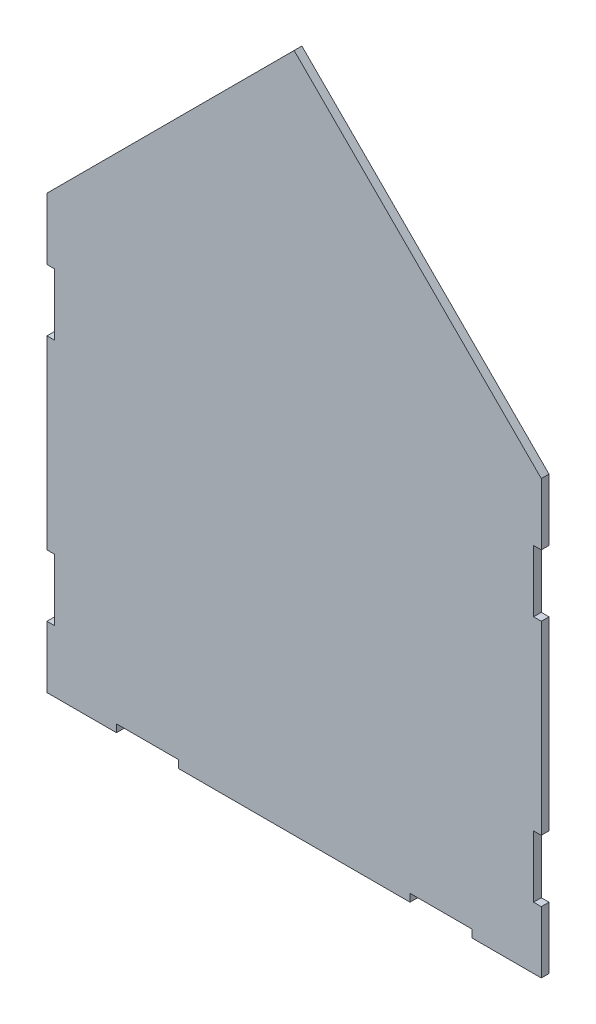
ISO-10303-21;
HEADER;
FILE_DESCRIPTION(('STEP AP214'),'2;1');
FILE_NAME('part.step','',(''),(''),'','','');
FILE_SCHEMA(('AUTOMOTIVE_DESIGN { 1 0 10303 214 1 1 1 1 }'));
ENDSEC;
DATA;
#1=APPLICATION_CONTEXT('core data for automotive mechanical design processes');
#2=APPLICATION_PROTOCOL_DEFINITION('international standard','automotive_design',2000,#1);
#3=PRODUCT_CONTEXT('',#1,'mechanical');
#4=PRODUCT('Part','Part','',(#3));
#5=PRODUCT_RELATED_PRODUCT_CATEGORY('part','',(#4));
#6=PRODUCT_DEFINITION_FORMATION('','',#4);
#7=PRODUCT_DEFINITION_CONTEXT('part definition',#1,'design');
#8=PRODUCT_DEFINITION('design','',#6,#7);
#9=PRODUCT_DEFINITION_SHAPE('','',#8);
#10=(LENGTH_UNIT() NAMED_UNIT(*) SI_UNIT(.MILLI.,.METRE.));
#11=(NAMED_UNIT(*) PLANE_ANGLE_UNIT() SI_UNIT($,.RADIAN.));
#12=(NAMED_UNIT(*) SI_UNIT($,.STERADIAN.) SOLID_ANGLE_UNIT());
#13=UNCERTAINTY_MEASURE_WITH_UNIT(LENGTH_MEASURE(1.E-05),#10,'distance_accuracy_value','');
#14=(GEOMETRIC_REPRESENTATION_CONTEXT(3) GLOBAL_UNCERTAINTY_ASSIGNED_CONTEXT((#13)) GLOBAL_UNIT_ASSIGNED_CONTEXT((#10,
#11,#12)) REPRESENTATION_CONTEXT('',''));
#15=CARTESIAN_POINT('',(0.,0.,0.));
#16=DIRECTION('',(0.,0.,1.));
#17=DIRECTION('',(1.,0.,0.));
#18=AXIS2_PLACEMENT_3D('',#15,#16,#17);
#19=CARTESIAN_POINT('',(102.496774406491,177.8,3.175));
#20=DIRECTION('',(-0.707106781186548,-0.707106781186548,0.));
#21=DIRECTION('',(0.707106781186548,-0.707106781186547,0.));
#22=AXIS2_PLACEMENT_3D('',#19,#20,#21);
#23=PLANE('',#22);
#24=DIRECTION('',(-0.707106781186547,0.707106781186547,0.));
#25=VECTOR('',#24,1.);
#26=CARTESIAN_POINT('',(102.496774406491,177.8,0.));
#27=LINE('',#26,#25);
#28=CARTESIAN_POINT('',(102.496774406491,177.8,0.));
#29=VERTEX_POINT('',#28);
#30=CARTESIAN_POINT('',(0.896774406491149,279.4,0.));
#31=VERTEX_POINT('',#30);
#32=EDGE_CURVE('E257',#29,#31,#27,.T.);
#33=ORIENTED_EDGE('',*,*,#32,.T.);
#34=DIRECTION('',(0.,0.,-1.));
#35=VECTOR('',#34,1.);
#36=CARTESIAN_POINT('',(0.896774406491149,279.4,3.175));
#37=LINE('',#36,#35);
#38=CARTESIAN_POINT('',(0.896774406491149,279.4,3.175));
#39=VERTEX_POINT('',#38);
#40=EDGE_CURVE('E11',#39,#31,#37,.T.);
#41=ORIENTED_EDGE('',*,*,#40,.F.);
#42=DIRECTION('',(-0.707106781186547,0.707106781186547,0.));
#43=VECTOR('',#42,1.);
#44=CARTESIAN_POINT('',(102.496774406491,177.8,3.175));
#45=LINE('',#44,#43);
#46=CARTESIAN_POINT('',(102.496774406491,177.8,3.175));
#47=VERTEX_POINT('',#46);
#48=EDGE_CURVE('E313',#47,#39,#45,.T.);
#49=ORIENTED_EDGE('',*,*,#48,.F.);
#50=DIRECTION('',(0.,0.,-1.));
#51=VECTOR('',#50,1.);
#52=CARTESIAN_POINT('',(102.496774406491,177.8,3.175));
#53=LINE('',#52,#51);
#54=EDGE_CURVE('E253',#47,#29,#53,.T.);
#55=ORIENTED_EDGE('',*,*,#54,.T.);
#56=EDGE_LOOP('',(#33,#41,#49,#55));
#57=FACE_BOUND('',#56,.T.);
#58=ADVANCED_FACE('F35',(#57),#23,.F.);
#59=CARTESIAN_POINT('',(0.896774406491149,279.4,3.175));
#60=DIRECTION('',(0.707106781186547,-0.707106781186548,0.));
#61=DIRECTION('',(0.707106781186548,0.707106781186547,0.));
#62=AXIS2_PLACEMENT_3D('',#59,#60,#61);
#63=PLANE('',#62);
#64=DIRECTION('',(-0.707106781186548,-0.707106781186547,0.));
#65=VECTOR('',#64,1.);
#66=CARTESIAN_POINT('',(0.896774406491149,279.4,0.));
#67=LINE('',#66,#65);
#68=CARTESIAN_POINT('',(-100.703225593509,177.8,0.));
#69=VERTEX_POINT('',#68);
#70=EDGE_CURVE('E260',#31,#69,#67,.T.);
#71=ORIENTED_EDGE('',*,*,#70,.T.);
#72=DIRECTION('',(0.,0.,-1.));
#73=VECTOR('',#72,1.);
#74=CARTESIAN_POINT('',(-100.703225593509,177.8,3.175));
#75=LINE('',#74,#73);
#76=CARTESIAN_POINT('',(-100.703225593509,177.8,3.175));
#77=VERTEX_POINT('',#76);
#78=EDGE_CURVE('E43',#77,#69,#75,.T.);
#79=ORIENTED_EDGE('',*,*,#78,.F.);
#80=DIRECTION('',(-0.707106781186548,-0.707106781186547,0.));
#81=VECTOR('',#80,1.);
#82=CARTESIAN_POINT('',(0.896774406491149,279.4,3.175));
#83=LINE('',#82,#81);
#84=EDGE_CURVE('E157',#39,#77,#83,.T.);
#85=ORIENTED_EDGE('',*,*,#84,.F.);
#86=ORIENTED_EDGE('',*,*,#40,.T.);
#87=EDGE_LOOP('',(#71,#79,#85,#86));
#88=FACE_BOUND('',#87,.T.);
#89=ADVANCED_FACE('F476',(#88),#63,.F.);
#90=CARTESIAN_POINT('',(-100.703225593509,177.8,3.175));
#91=DIRECTION('',(1.,0.,0.));
#92=DIRECTION('',(0.,1.,0.));
#93=AXIS2_PLACEMENT_3D('',#90,#91,#92);
#94=PLANE('',#93);
#95=DIRECTION('',(0.,-1.,0.));
#96=VECTOR('',#95,1.);
#97=CARTESIAN_POINT('',(-100.703225593509,177.8,0.));
#98=LINE('',#97,#96);
#99=CARTESIAN_POINT('',(-100.703225593509,152.4,0.));
#100=VERTEX_POINT('',#99);
#101=EDGE_CURVE('E262',#69,#100,#98,.T.);
#102=ORIENTED_EDGE('',*,*,#101,.T.);
#103=DIRECTION('',(0.,0.,-1.));
#104=VECTOR('',#103,1.);
#105=CARTESIAN_POINT('',(-100.703225593509,152.4,3.175));
#106=LINE('',#105,#104);
#107=CARTESIAN_POINT('',(-100.703225593509,152.4,3.175));
#108=VERTEX_POINT('',#107);
#109=EDGE_CURVE('E383',#108,#100,#106,.T.);
#110=ORIENTED_EDGE('',*,*,#109,.F.);
#111=DIRECTION('',(0.,-1.,0.));
#112=VECTOR('',#111,1.);
#113=CARTESIAN_POINT('',(-100.703225593509,177.8,3.175));
#114=LINE('',#113,#112);
#115=EDGE_CURVE('E391',#77,#108,#114,.T.);
#116=ORIENTED_EDGE('',*,*,#115,.F.);
#117=ORIENTED_EDGE('',*,*,#78,.T.);
#118=EDGE_LOOP('',(#102,#110,#116,#117));
#119=FACE_BOUND('',#118,.T.);
#120=ADVANCED_FACE('F389',(#119),#94,.F.);
#121=CARTESIAN_POINT('',(-100.703225593509,152.4,3.175));
#122=DIRECTION('',(0.,1.,0.));
#123=DIRECTION('',(0.,0.,1.));
#124=AXIS2_PLACEMENT_3D('',#121,#122,#123);
#125=PLANE('',#124);
#126=DIRECTION('',(1.,0.,0.));
#127=VECTOR('',#126,1.);
#128=CARTESIAN_POINT('',(-100.703225593509,152.4,0.));
#129=LINE('',#128,#127);
#130=CARTESIAN_POINT('',(-97.5282255935089,152.4,0.));
#131=VERTEX_POINT('',#130);
#132=EDGE_CURVE('E264',#100,#131,#129,.T.);
#133=ORIENTED_EDGE('',*,*,#132,.T.);
#134=DIRECTION('',(0.,0.,-1.));
#135=VECTOR('',#134,1.);
#136=CARTESIAN_POINT('',(-97.5282255935089,152.4,3.175));
#137=LINE('',#136,#135);
#138=CARTESIAN_POINT('',(-97.5282255935089,152.4,3.175));
#139=VERTEX_POINT('',#138);
#140=EDGE_CURVE('E380',#139,#131,#137,.T.);
#141=ORIENTED_EDGE('',*,*,#140,.F.);
#142=DIRECTION('',(1.,0.,0.));
#143=VECTOR('',#142,1.);
#144=CARTESIAN_POINT('',(-100.703225593509,152.4,3.175));
#145=LINE('',#144,#143);
#146=EDGE_CURVE('E409',#108,#139,#145,.T.);
#147=ORIENTED_EDGE('',*,*,#146,.F.);
#148=ORIENTED_EDGE('',*,*,#109,.T.);
#149=EDGE_LOOP('',(#133,#141,#147,#148));
#150=FACE_BOUND('',#149,.T.);
#151=ADVANCED_FACE('F400',(#150),#125,.F.);
#152=CARTESIAN_POINT('',(-97.5282255935089,152.4,3.175));
#153=DIRECTION('',(1.,0.,0.));
#154=DIRECTION('',(0.,1.,0.));
#155=AXIS2_PLACEMENT_3D('',#152,#153,#154);
#156=PLANE('',#155);
#157=DIRECTION('',(0.,-1.,0.));
#158=VECTOR('',#157,1.);
#159=CARTESIAN_POINT('',(-97.5282255935089,152.4,0.));
#160=LINE('',#159,#158);
#161=CARTESIAN_POINT('',(-97.5282255935089,127.,0.));
#162=VERTEX_POINT('',#161);
#163=EDGE_CURVE('E266',#131,#162,#160,.T.);
#164=ORIENTED_EDGE('',*,*,#163,.T.);
#165=DIRECTION('',(0.,0.,-1.));
#166=VECTOR('',#165,1.);
#167=CARTESIAN_POINT('',(-97.5282255935089,127.,3.175));
#168=LINE('',#167,#166);
#169=CARTESIAN_POINT('',(-97.5282255935089,127.,3.175));
#170=VERTEX_POINT('',#169);
#171=EDGE_CURVE('E377',#170,#162,#168,.T.);
#172=ORIENTED_EDGE('',*,*,#171,.F.);
#173=DIRECTION('',(0.,-1.,0.));
#174=VECTOR('',#173,1.);
#175=CARTESIAN_POINT('',(-97.5282255935089,152.4,3.175));
#176=LINE('',#175,#174);
#177=EDGE_CURVE('E406',#139,#170,#176,.T.);
#178=ORIENTED_EDGE('',*,*,#177,.F.);
#179=ORIENTED_EDGE('',*,*,#140,.T.);
#180=EDGE_LOOP('',(#164,#172,#178,#179));
#181=FACE_BOUND('',#180,.T.);
#182=ADVANCED_FACE('F404',(#181),#156,.F.);
#183=CARTESIAN_POINT('',(-97.5282255935089,127.,3.175));
#184=DIRECTION('',(0.,-1.,0.));
#185=DIRECTION('',(0.,0.,-1.));
#186=AXIS2_PLACEMENT_3D('',#183,#184,#185);
#187=PLANE('',#186);
#188=DIRECTION('',(-1.,0.,0.));
#189=VECTOR('',#188,1.);
#190=CARTESIAN_POINT('',(-97.5282255935089,127.,0.));
#191=LINE('',#190,#189);
#192=CARTESIAN_POINT('',(-100.703225593509,127.,0.));
#193=VERTEX_POINT('',#192);
#194=EDGE_CURVE('E268',#162,#193,#191,.T.);
#195=ORIENTED_EDGE('',*,*,#194,.T.);
#196=DIRECTION('',(0.,0.,-1.));
#197=VECTOR('',#196,1.);
#198=CARTESIAN_POINT('',(-100.703225593509,127.,3.175));
#199=LINE('',#198,#197);
#200=CARTESIAN_POINT('',(-100.703225593509,127.,3.175));
#201=VERTEX_POINT('',#200);
#202=EDGE_CURVE('E374',#201,#193,#199,.T.);
#203=ORIENTED_EDGE('',*,*,#202,.F.);
#204=DIRECTION('',(-1.,0.,0.));
#205=VECTOR('',#204,1.);
#206=CARTESIAN_POINT('',(-97.5282255935089,127.,3.175));
#207=LINE('',#206,#205);
#208=EDGE_CURVE('E408',#170,#201,#207,.T.);
#209=ORIENTED_EDGE('',*,*,#208,.F.);
#210=ORIENTED_EDGE('',*,*,#171,.T.);
#211=EDGE_LOOP('',(#195,#203,#209,#210));
#212=FACE_BOUND('',#211,.T.);
#213=ADVANCED_FACE('F489',(#212),#187,.F.);
#214=CARTESIAN_POINT('',(-100.703225593509,127.,3.175));
#215=DIRECTION('',(1.,0.,0.));
#216=DIRECTION('',(0.,1.,0.));
#217=AXIS2_PLACEMENT_3D('',#214,#215,#216);
#218=PLANE('',#217);
#219=DIRECTION('',(0.,-1.,0.));
#220=VECTOR('',#219,1.);
#221=CARTESIAN_POINT('',(-100.703225593509,127.,0.));
#222=LINE('',#221,#220);
#223=CARTESIAN_POINT('',(-100.703225593509,50.8,0.));
#224=VERTEX_POINT('',#223);
#225=EDGE_CURVE('E270',#193,#224,#222,.T.);
#226=ORIENTED_EDGE('',*,*,#225,.T.);
#227=DIRECTION('',(0.,0.,-1.));
#228=VECTOR('',#227,1.);
#229=CARTESIAN_POINT('',(-100.703225593509,50.8,3.175));
#230=LINE('',#229,#228);
#231=CARTESIAN_POINT('',(-100.703225593509,50.8,3.175));
#232=VERTEX_POINT('',#231);
#233=EDGE_CURVE('E371',#232,#224,#230,.T.);
#234=ORIENTED_EDGE('',*,*,#233,.F.);
#235=DIRECTION('',(0.,-1.,0.));
#236=VECTOR('',#235,1.);
#237=CARTESIAN_POINT('',(-100.703225593509,127.,3.175));
#238=LINE('',#237,#236);
#239=EDGE_CURVE('E411',#201,#232,#238,.T.);
#240=ORIENTED_EDGE('',*,*,#239,.F.);
#241=ORIENTED_EDGE('',*,*,#202,.T.);
#242=EDGE_LOOP('',(#226,#234,#240,#241));
#243=FACE_BOUND('',#242,.T.);
#244=ADVANCED_FACE('F492',(#243),#218,.F.);
#245=CARTESIAN_POINT('',(-100.703225593509,50.8,3.175));
#246=DIRECTION('',(0.,1.,0.));
#247=DIRECTION('',(0.,0.,1.));
#248=AXIS2_PLACEMENT_3D('',#245,#246,#247);
#249=PLANE('',#248);
#250=DIRECTION('',(1.,0.,0.));
#251=VECTOR('',#250,1.);
#252=CARTESIAN_POINT('',(-100.703225593509,50.8,0.));
#253=LINE('',#252,#251);
#254=CARTESIAN_POINT('',(-97.5282255935089,50.8,0.));
#255=VERTEX_POINT('',#254);
#256=EDGE_CURVE('E272',#224,#255,#253,.T.);
#257=ORIENTED_EDGE('',*,*,#256,.T.);
#258=DIRECTION('',(0.,0.,-1.));
#259=VECTOR('',#258,1.);
#260=CARTESIAN_POINT('',(-97.5282255935089,50.8,3.175));
#261=LINE('',#260,#259);
#262=CARTESIAN_POINT('',(-97.5282255935089,50.8,3.175));
#263=VERTEX_POINT('',#262);
#264=EDGE_CURVE('E368',#263,#255,#261,.T.);
#265=ORIENTED_EDGE('',*,*,#264,.F.);
#266=DIRECTION('',(1.,0.,0.));
#267=VECTOR('',#266,1.);
#268=CARTESIAN_POINT('',(-100.703225593509,50.8,3.175));
#269=LINE('',#268,#267);
#270=EDGE_CURVE('E417',#232,#263,#269,.T.);
#271=ORIENTED_EDGE('',*,*,#270,.F.);
#272=ORIENTED_EDGE('',*,*,#233,.T.);
#273=EDGE_LOOP('',(#257,#265,#271,#272));
#274=FACE_BOUND('',#273,.T.);
#275=ADVANCED_FACE('F496',(#274),#249,.F.);
#276=CARTESIAN_POINT('',(-97.5282255935089,50.8,3.175));
#277=DIRECTION('',(1.,0.,0.));
#278=DIRECTION('',(0.,0.,-1.));
#279=AXIS2_PLACEMENT_3D('',#276,#277,#278);
#280=PLANE('',#279);
#281=DIRECTION('',(0.,-1.,0.));
#282=VECTOR('',#281,1.);
#283=CARTESIAN_POINT('',(-97.5282255935089,50.8,0.));
#284=LINE('',#283,#282);
#285=CARTESIAN_POINT('',(-97.5282255935089,25.4,0.));
#286=VERTEX_POINT('',#285);
#287=EDGE_CURVE('E274',#255,#286,#284,.T.);
#288=ORIENTED_EDGE('',*,*,#287,.T.);
#289=DIRECTION('',(0.,0.,-1.));
#290=VECTOR('',#289,1.);
#291=CARTESIAN_POINT('',(-97.5282255935089,25.4,3.175));
#292=LINE('',#291,#290);
#293=CARTESIAN_POINT('',(-97.5282255935089,25.4,3.175));
#294=VERTEX_POINT('',#293);
#295=EDGE_CURVE('E365',#294,#286,#292,.T.);
#296=ORIENTED_EDGE('',*,*,#295,.F.);
#297=DIRECTION('',(0.,-1.,0.));
#298=VECTOR('',#297,1.);
#299=CARTESIAN_POINT('',(-97.5282255935089,50.8,3.175));
#300=LINE('',#299,#298);
#301=EDGE_CURVE('E419',#263,#294,#300,.T.);
#302=ORIENTED_EDGE('',*,*,#301,.F.);
#303=ORIENTED_EDGE('',*,*,#264,.T.);
#304=EDGE_LOOP('',(#288,#296,#302,#303));
#305=FACE_BOUND('',#304,.T.);
#306=ADVANCED_FACE('F500',(#305),#280,.F.);
#307=CARTESIAN_POINT('',(-97.5282255935089,25.4,3.175));
#308=DIRECTION('',(0.,-1.,0.));
#309=DIRECTION('',(0.,0.,-1.));
#310=AXIS2_PLACEMENT_3D('',#307,#308,#309);
#311=PLANE('',#310);
#312=DIRECTION('',(-1.,0.,0.));
#313=VECTOR('',#312,1.);
#314=CARTESIAN_POINT('',(-97.5282255935089,25.4,0.));
#315=LINE('',#314,#313);
#316=CARTESIAN_POINT('',(-100.703225593509,25.4,0.));
#317=VERTEX_POINT('',#316);
#318=EDGE_CURVE('E276',#286,#317,#315,.T.);
#319=ORIENTED_EDGE('',*,*,#318,.T.);
#320=DIRECTION('',(0.,0.,-1.));
#321=VECTOR('',#320,1.);
#322=CARTESIAN_POINT('',(-100.703225593509,25.4,3.175));
#323=LINE('',#322,#321);
#324=CARTESIAN_POINT('',(-100.703225593509,25.4,3.175));
#325=VERTEX_POINT('',#324);
#326=EDGE_CURVE('E362',#325,#317,#323,.T.);
#327=ORIENTED_EDGE('',*,*,#326,.F.);
#328=DIRECTION('',(-1.,0.,0.));
#329=VECTOR('',#328,1.);
#330=CARTESIAN_POINT('',(-97.5282255935089,25.4,3.175));
#331=LINE('',#330,#329);
#332=EDGE_CURVE('E421',#294,#325,#331,.T.);
#333=ORIENTED_EDGE('',*,*,#332,.F.);
#334=ORIENTED_EDGE('',*,*,#295,.T.);
#335=EDGE_LOOP('',(#319,#327,#333,#334));
#336=FACE_BOUND('',#335,.T.);
#337=ADVANCED_FACE('F504',(#336),#311,.F.);
#338=CARTESIAN_POINT('',(-100.703225593509,25.4,3.175));
#339=DIRECTION('',(1.,0.,0.));
#340=DIRECTION('',(0.,1.,0.));
#341=AXIS2_PLACEMENT_3D('',#338,#339,#340);
#342=PLANE('',#341);
#343=DIRECTION('',(0.,-1.,0.));
#344=VECTOR('',#343,1.);
#345=CARTESIAN_POINT('',(-100.703225593509,25.4,0.));
#346=LINE('',#345,#344);
#347=CARTESIAN_POINT('',(-100.703225593509,0.,0.));
#348=VERTEX_POINT('',#347);
#349=EDGE_CURVE('E278',#317,#348,#346,.T.);
#350=ORIENTED_EDGE('',*,*,#349,.T.);
#351=DIRECTION('',(0.,0.,-1.));
#352=VECTOR('',#351,1.);
#353=CARTESIAN_POINT('',(-100.703225593509,0.,3.175));
#354=LINE('',#353,#352);
#355=CARTESIAN_POINT('',(-100.703225593509,0.,3.175));
#356=VERTEX_POINT('',#355);
#357=EDGE_CURVE('E359',#356,#348,#354,.T.);
#358=ORIENTED_EDGE('',*,*,#357,.F.);
#359=DIRECTION('',(0.,-1.,0.));
#360=VECTOR('',#359,1.);
#361=CARTESIAN_POINT('',(-100.703225593509,25.4,3.175));
#362=LINE('',#361,#360);
#363=EDGE_CURVE('E423',#325,#356,#362,.T.);
#364=ORIENTED_EDGE('',*,*,#363,.F.);
#365=ORIENTED_EDGE('',*,*,#326,.T.);
#366=EDGE_LOOP('',(#350,#358,#364,#365));
#367=FACE_BOUND('',#366,.T.);
#368=ADVANCED_FACE('F508',(#367),#342,.F.);
#369=CARTESIAN_POINT('',(-100.703225593509,0.,3.175));
#370=DIRECTION('',(0.,1.,0.));
#371=DIRECTION('',(-1.,0.,0.));
#372=AXIS2_PLACEMENT_3D('',#369,#370,#371);
#373=PLANE('',#372);
#374=DIRECTION('',(1.,0.,0.));
#375=VECTOR('',#374,1.);
#376=CARTESIAN_POINT('',(-100.703225593509,0.,0.));
#377=LINE('',#376,#375);
#378=CARTESIAN_POINT('',(-72.1282255935088,0.,0.));
#379=VERTEX_POINT('',#378);
#380=EDGE_CURVE('E280',#348,#379,#377,.T.);
#381=ORIENTED_EDGE('',*,*,#380,.T.);
#382=DIRECTION('',(0.,0.,-1.));
#383=VECTOR('',#382,1.);
#384=CARTESIAN_POINT('',(-72.1282255935088,0.,3.175));
#385=LINE('',#384,#383);
#386=CARTESIAN_POINT('',(-72.1282255935088,0.,3.175));
#387=VERTEX_POINT('',#386);
#388=EDGE_CURVE('E356',#387,#379,#385,.T.);
#389=ORIENTED_EDGE('',*,*,#388,.F.);
#390=DIRECTION('',(1.,0.,0.));
#391=VECTOR('',#390,1.);
#392=CARTESIAN_POINT('',(-100.703225593509,0.,3.175));
#393=LINE('',#392,#391);
#394=EDGE_CURVE('E425',#356,#387,#393,.T.);
#395=ORIENTED_EDGE('',*,*,#394,.F.);
#396=ORIENTED_EDGE('',*,*,#357,.T.);
#397=EDGE_LOOP('',(#381,#389,#395,#396));
#398=FACE_BOUND('',#397,.T.);
#399=ADVANCED_FACE('F512',(#398),#373,.F.);
#400=CARTESIAN_POINT('',(-72.1282255935088,0.,3.175));
#401=DIRECTION('',(-1.,0.,0.));
#402=DIRECTION('',(0.,0.,1.));
#403=AXIS2_PLACEMENT_3D('',#400,#401,#402);
#404=PLANE('',#403);
#405=DIRECTION('',(0.,1.,0.));
#406=VECTOR('',#405,1.);
#407=CARTESIAN_POINT('',(-72.1282255935088,0.,0.));
#408=LINE('',#407,#406);
#409=CARTESIAN_POINT('',(-72.1282255935088,3.17499999999996,0.));
#410=VERTEX_POINT('',#409);
#411=EDGE_CURVE('E282',#379,#410,#408,.T.);
#412=ORIENTED_EDGE('',*,*,#411,.T.);
#413=DIRECTION('',(0.,0.,-1.));
#414=VECTOR('',#413,1.);
#415=CARTESIAN_POINT('',(-72.1282255935088,3.17499999999996,3.175));
#416=LINE('',#415,#414);
#417=CARTESIAN_POINT('',(-72.1282255935088,3.17499999999996,3.175));
#418=VERTEX_POINT('',#417);
#419=EDGE_CURVE('E353',#418,#410,#416,.T.);
#420=ORIENTED_EDGE('',*,*,#419,.F.);
#421=DIRECTION('',(0.,1.,0.));
#422=VECTOR('',#421,1.);
#423=CARTESIAN_POINT('',(-72.1282255935088,0.,3.175));
#424=LINE('',#423,#422);
#425=EDGE_CURVE('E427',#387,#418,#424,.T.);
#426=ORIENTED_EDGE('',*,*,#425,.F.);
#427=ORIENTED_EDGE('',*,*,#388,.T.);
#428=EDGE_LOOP('',(#412,#420,#426,#427));
#429=FACE_BOUND('',#428,.T.);
#430=ADVANCED_FACE('F516',(#429),#404,.F.);
#431=CARTESIAN_POINT('',(-72.1282255935088,3.17499999999996,3.175));
#432=DIRECTION('',(0.,1.,0.));
#433=DIRECTION('',(0.,0.,1.));
#434=AXIS2_PLACEMENT_3D('',#431,#432,#433);
#435=PLANE('',#434);
#436=DIRECTION('',(1.,0.,0.));
#437=VECTOR('',#436,1.);
#438=CARTESIAN_POINT('',(-72.1282255935088,3.17499999999996,0.));
#439=LINE('',#438,#437);
#440=CARTESIAN_POINT('',(-46.7282255935088,3.17499999999996,0.));
#441=VERTEX_POINT('',#440);
#442=EDGE_CURVE('E284',#410,#441,#439,.T.);
#443=ORIENTED_EDGE('',*,*,#442,.T.);
#444=DIRECTION('',(0.,0.,-1.));
#445=VECTOR('',#444,1.);
#446=CARTESIAN_POINT('',(-46.7282255935088,3.17499999999996,3.175));
#447=LINE('',#446,#445);
#448=CARTESIAN_POINT('',(-46.7282255935088,3.17499999999996,3.175));
#449=VERTEX_POINT('',#448);
#450=EDGE_CURVE('E350',#449,#441,#447,.T.);
#451=ORIENTED_EDGE('',*,*,#450,.F.);
#452=DIRECTION('',(1.,0.,0.));
#453=VECTOR('',#452,1.);
#454=CARTESIAN_POINT('',(-72.1282255935088,3.17499999999996,3.175));
#455=LINE('',#454,#453);
#456=EDGE_CURVE('E429',#418,#449,#455,.T.);
#457=ORIENTED_EDGE('',*,*,#456,.F.);
#458=ORIENTED_EDGE('',*,*,#419,.T.);
#459=EDGE_LOOP('',(#443,#451,#457,#458));
#460=FACE_BOUND('',#459,.T.);
#461=ADVANCED_FACE('F520',(#460),#435,.F.);
#462=CARTESIAN_POINT('',(-46.7282255935088,3.17499999999996,3.175));
#463=DIRECTION('',(1.,0.,0.));
#464=DIRECTION('',(0.,0.,-1.));
#465=AXIS2_PLACEMENT_3D('',#462,#463,#464);
#466=PLANE('',#465);
#467=DIRECTION('',(0.,-1.,0.));
#468=VECTOR('',#467,1.);
#469=CARTESIAN_POINT('',(-46.7282255935088,3.17499999999996,0.));
#470=LINE('',#469,#468);
#471=CARTESIAN_POINT('',(-46.7282255935088,0.,0.));
#472=VERTEX_POINT('',#471);
#473=EDGE_CURVE('E286',#441,#472,#470,.T.);
#474=ORIENTED_EDGE('',*,*,#473,.T.);
#475=DIRECTION('',(0.,0.,-1.));
#476=VECTOR('',#475,1.);
#477=CARTESIAN_POINT('',(-46.7282255935088,0.,3.175));
#478=LINE('',#477,#476);
#479=CARTESIAN_POINT('',(-46.7282255935088,0.,3.175));
#480=VERTEX_POINT('',#479);
#481=EDGE_CURVE('E347',#480,#472,#478,.T.);
#482=ORIENTED_EDGE('',*,*,#481,.F.);
#483=DIRECTION('',(0.,-1.,0.));
#484=VECTOR('',#483,1.);
#485=CARTESIAN_POINT('',(-46.7282255935088,3.17499999999996,3.175));
#486=LINE('',#485,#484);
#487=EDGE_CURVE('E431',#449,#480,#486,.T.);
#488=ORIENTED_EDGE('',*,*,#487,.F.);
#489=ORIENTED_EDGE('',*,*,#450,.T.);
#490=EDGE_LOOP('',(#474,#482,#488,#489));
#491=FACE_BOUND('',#490,.T.);
#492=ADVANCED_FACE('F524',(#491),#466,.F.);
#493=CARTESIAN_POINT('',(-46.7282255935088,0.,3.175));
#494=DIRECTION('',(0.,1.,0.));
#495=DIRECTION('',(0.,0.,1.));
#496=AXIS2_PLACEMENT_3D('',#493,#494,#495);
#497=PLANE('',#496);
#498=DIRECTION('',(1.,0.,0.));
#499=VECTOR('',#498,1.);
#500=CARTESIAN_POINT('',(-46.7282255935088,0.,0.));
#501=LINE('',#500,#499);
#502=CARTESIAN_POINT('',(48.5217744064912,0.,0.));
#503=VERTEX_POINT('',#502);
#504=EDGE_CURVE('E288',#472,#503,#501,.T.);
#505=ORIENTED_EDGE('',*,*,#504,.T.);
#506=DIRECTION('',(0.,0.,-1.));
#507=VECTOR('',#506,1.);
#508=CARTESIAN_POINT('',(48.5217744064912,0.,3.175));
#509=LINE('',#508,#507);
#510=CARTESIAN_POINT('',(48.5217744064912,0.,3.175));
#511=VERTEX_POINT('',#510);
#512=EDGE_CURVE('E344',#511,#503,#509,.T.);
#513=ORIENTED_EDGE('',*,*,#512,.F.);
#514=DIRECTION('',(1.,0.,0.));
#515=VECTOR('',#514,1.);
#516=CARTESIAN_POINT('',(-46.7282255935088,0.,3.175));
#517=LINE('',#516,#515);
#518=EDGE_CURVE('E433',#480,#511,#517,.T.);
#519=ORIENTED_EDGE('',*,*,#518,.F.);
#520=ORIENTED_EDGE('',*,*,#481,.T.);
#521=EDGE_LOOP('',(#505,#513,#519,#520));
#522=FACE_BOUND('',#521,.T.);
#523=ADVANCED_FACE('F528',(#522),#497,.F.);
#524=CARTESIAN_POINT('',(48.5217744064912,0.,3.175));
#525=DIRECTION('',(-1.,0.,0.));
#526=DIRECTION('',(0.,-1.,0.));
#527=AXIS2_PLACEMENT_3D('',#524,#525,#526);
#528=PLANE('',#527);
#529=DIRECTION('',(0.,1.,0.));
#530=VECTOR('',#529,1.);
#531=CARTESIAN_POINT('',(48.5217744064912,0.,0.));
#532=LINE('',#531,#530);
#533=CARTESIAN_POINT('',(48.5217744064912,3.17499999999998,0.));
#534=VERTEX_POINT('',#533);
#535=EDGE_CURVE('E290',#503,#534,#532,.T.);
#536=ORIENTED_EDGE('',*,*,#535,.T.);
#537=DIRECTION('',(0.,0.,-1.));
#538=VECTOR('',#537,1.);
#539=CARTESIAN_POINT('',(48.5217744064912,3.17499999999998,3.175));
#540=LINE('',#539,#538);
#541=CARTESIAN_POINT('',(48.5217744064912,3.17499999999998,3.175));
#542=VERTEX_POINT('',#541);
#543=EDGE_CURVE('E341',#542,#534,#540,.T.);
#544=ORIENTED_EDGE('',*,*,#543,.F.);
#545=DIRECTION('',(0.,1.,0.));
#546=VECTOR('',#545,1.);
#547=CARTESIAN_POINT('',(48.5217744064912,0.,3.175));
#548=LINE('',#547,#546);
#549=EDGE_CURVE('E435',#511,#542,#548,.T.);
#550=ORIENTED_EDGE('',*,*,#549,.F.);
#551=ORIENTED_EDGE('',*,*,#512,.T.);
#552=EDGE_LOOP('',(#536,#544,#550,#551));
#553=FACE_BOUND('',#552,.T.);
#554=ADVANCED_FACE('F532',(#553),#528,.F.);
#555=CARTESIAN_POINT('',(48.5217744064912,3.17499999999998,3.175));
#556=DIRECTION('',(0.,1.,0.));
#557=DIRECTION('',(-1.,0.,0.));
#558=AXIS2_PLACEMENT_3D('',#555,#556,#557);
#559=PLANE('',#558);
#560=DIRECTION('',(1.,0.,0.));
#561=VECTOR('',#560,1.);
#562=CARTESIAN_POINT('',(48.5217744064912,3.17499999999998,0.));
#563=LINE('',#562,#561);
#564=CARTESIAN_POINT('',(73.9217744064912,3.17499999999996,0.));
#565=VERTEX_POINT('',#564);
#566=EDGE_CURVE('E292',#534,#565,#563,.T.);
#567=ORIENTED_EDGE('',*,*,#566,.T.);
#568=DIRECTION('',(0.,0.,-1.));
#569=VECTOR('',#568,1.);
#570=CARTESIAN_POINT('',(73.9217744064912,3.17499999999996,3.175));
#571=LINE('',#570,#569);
#572=CARTESIAN_POINT('',(73.9217744064912,3.17499999999996,3.175));
#573=VERTEX_POINT('',#572);
#574=EDGE_CURVE('E338',#573,#565,#571,.T.);
#575=ORIENTED_EDGE('',*,*,#574,.F.);
#576=DIRECTION('',(1.,0.,0.));
#577=VECTOR('',#576,1.);
#578=CARTESIAN_POINT('',(48.5217744064912,3.17499999999998,3.175));
#579=LINE('',#578,#577);
#580=EDGE_CURVE('E437',#542,#573,#579,.T.);
#581=ORIENTED_EDGE('',*,*,#580,.F.);
#582=ORIENTED_EDGE('',*,*,#543,.T.);
#583=EDGE_LOOP('',(#567,#575,#581,#582));
#584=FACE_BOUND('',#583,.T.);
#585=ADVANCED_FACE('F536',(#584),#559,.F.);
#586=CARTESIAN_POINT('',(73.9217744064912,3.17499999999996,3.175));
#587=DIRECTION('',(1.,0.,0.));
#588=DIRECTION('',(0.,0.,-1.));
#589=AXIS2_PLACEMENT_3D('',#586,#587,#588);
#590=PLANE('',#589);
#591=DIRECTION('',(0.,-1.,0.));
#592=VECTOR('',#591,1.);
#593=CARTESIAN_POINT('',(73.9217744064912,3.17499999999996,0.));
#594=LINE('',#593,#592);
#595=CARTESIAN_POINT('',(73.9217744064912,0.,0.));
#596=VERTEX_POINT('',#595);
#597=EDGE_CURVE('E294',#565,#596,#594,.T.);
#598=ORIENTED_EDGE('',*,*,#597,.T.);
#599=DIRECTION('',(0.,0.,-1.));
#600=VECTOR('',#599,1.);
#601=CARTESIAN_POINT('',(73.9217744064912,0.,3.175));
#602=LINE('',#601,#600);
#603=CARTESIAN_POINT('',(73.9217744064912,0.,3.175));
#604=VERTEX_POINT('',#603);
#605=EDGE_CURVE('E335',#604,#596,#602,.T.);
#606=ORIENTED_EDGE('',*,*,#605,.F.);
#607=DIRECTION('',(0.,-1.,0.));
#608=VECTOR('',#607,1.);
#609=CARTESIAN_POINT('',(73.9217744064912,3.17499999999996,3.175));
#610=LINE('',#609,#608);
#611=EDGE_CURVE('E439',#573,#604,#610,.T.);
#612=ORIENTED_EDGE('',*,*,#611,.F.);
#613=ORIENTED_EDGE('',*,*,#574,.T.);
#614=EDGE_LOOP('',(#598,#606,#612,#613));
#615=FACE_BOUND('',#614,.T.);
#616=ADVANCED_FACE('F540',(#615),#590,.F.);
#617=CARTESIAN_POINT('',(73.9217744064912,0.,3.175));
#618=DIRECTION('',(0.,1.,0.));
#619=DIRECTION('',(-1.,0.,0.));
#620=AXIS2_PLACEMENT_3D('',#617,#618,#619);
#621=PLANE('',#620);
#622=DIRECTION('',(1.,0.,0.));
#623=VECTOR('',#622,1.);
#624=CARTESIAN_POINT('',(73.9217744064912,0.,0.));
#625=LINE('',#624,#623);
#626=CARTESIAN_POINT('',(102.496774406491,0.,0.));
#627=VERTEX_POINT('',#626);
#628=EDGE_CURVE('E296',#596,#627,#625,.T.);
#629=ORIENTED_EDGE('',*,*,#628,.T.);
#630=DIRECTION('',(0.,0.,-1.));
#631=VECTOR('',#630,1.);
#632=CARTESIAN_POINT('',(102.496774406491,0.,3.175));
#633=LINE('',#632,#631);
#634=CARTESIAN_POINT('',(102.496774406491,0.,3.175));
#635=VERTEX_POINT('',#634);
#636=EDGE_CURVE('E332',#635,#627,#633,.T.);
#637=ORIENTED_EDGE('',*,*,#636,.F.);
#638=DIRECTION('',(1.,0.,0.));
#639=VECTOR('',#638,1.);
#640=CARTESIAN_POINT('',(73.9217744064912,0.,3.175));
#641=LINE('',#640,#639);
#642=EDGE_CURVE('E441',#604,#635,#641,.T.);
#643=ORIENTED_EDGE('',*,*,#642,.F.);
#644=ORIENTED_EDGE('',*,*,#605,.T.);
#645=EDGE_LOOP('',(#629,#637,#643,#644));
#646=FACE_BOUND('',#645,.T.);
#647=ADVANCED_FACE('F544',(#646),#621,.F.);
#648=CARTESIAN_POINT('',(102.496774406491,0.,3.175));
#649=DIRECTION('',(-1.,0.,0.));
#650=DIRECTION('',(0.,0.,1.));
#651=AXIS2_PLACEMENT_3D('',#648,#649,#650);
#652=PLANE('',#651);
#653=DIRECTION('',(0.,1.,0.));
#654=VECTOR('',#653,1.);
#655=CARTESIAN_POINT('',(102.496774406491,0.,0.));
#656=LINE('',#655,#654);
#657=CARTESIAN_POINT('',(102.496774406491,25.4,0.));
#658=VERTEX_POINT('',#657);
#659=EDGE_CURVE('E298',#627,#658,#656,.T.);
#660=ORIENTED_EDGE('',*,*,#659,.T.);
#661=DIRECTION('',(0.,0.,-1.));
#662=VECTOR('',#661,1.);
#663=CARTESIAN_POINT('',(102.496774406491,25.4,3.175));
#664=LINE('',#663,#662);
#665=CARTESIAN_POINT('',(102.496774406491,25.4,3.175));
#666=VERTEX_POINT('',#665);
#667=EDGE_CURVE('E329',#666,#658,#664,.T.);
#668=ORIENTED_EDGE('',*,*,#667,.F.);
#669=DIRECTION('',(0.,1.,0.));
#670=VECTOR('',#669,1.);
#671=CARTESIAN_POINT('',(102.496774406491,0.,3.175));
#672=LINE('',#671,#670);
#673=EDGE_CURVE('E443',#635,#666,#672,.T.);
#674=ORIENTED_EDGE('',*,*,#673,.F.);
#675=ORIENTED_EDGE('',*,*,#636,.T.);
#676=EDGE_LOOP('',(#660,#668,#674,#675));
#677=FACE_BOUND('',#676,.T.);
#678=ADVANCED_FACE('F548',(#677),#652,.F.);
#679=CARTESIAN_POINT('',(102.496774406491,25.4,3.175));
#680=DIRECTION('',(0.,-1.,0.));
#681=DIRECTION('',(1.,0.,0.));
#682=AXIS2_PLACEMENT_3D('',#679,#680,#681);
#683=PLANE('',#682);
#684=DIRECTION('',(-1.,0.,0.));
#685=VECTOR('',#684,1.);
#686=CARTESIAN_POINT('',(102.496774406491,25.4,0.));
#687=LINE('',#686,#685);
#688=CARTESIAN_POINT('',(99.3217744064912,25.4,0.));
#689=VERTEX_POINT('',#688);
#690=EDGE_CURVE('E300',#658,#689,#687,.T.);
#691=ORIENTED_EDGE('',*,*,#690,.T.);
#692=DIRECTION('',(0.,0.,-1.));
#693=VECTOR('',#692,1.);
#694=CARTESIAN_POINT('',(99.3217744064912,25.4,3.175));
#695=LINE('',#694,#693);
#696=CARTESIAN_POINT('',(99.3217744064912,25.4,3.175));
#697=VERTEX_POINT('',#696);
#698=EDGE_CURVE('E326',#697,#689,#695,.T.);
#699=ORIENTED_EDGE('',*,*,#698,.F.);
#700=DIRECTION('',(-1.,0.,0.));
#701=VECTOR('',#700,1.);
#702=CARTESIAN_POINT('',(102.496774406491,25.4,3.175));
#703=LINE('',#702,#701);
#704=EDGE_CURVE('E445',#666,#697,#703,.T.);
#705=ORIENTED_EDGE('',*,*,#704,.F.);
#706=ORIENTED_EDGE('',*,*,#667,.T.);
#707=EDGE_LOOP('',(#691,#699,#705,#706));
#708=FACE_BOUND('',#707,.T.);
#709=ADVANCED_FACE('F552',(#708),#683,.F.);
#710=CARTESIAN_POINT('',(99.3217744064912,25.4,3.175));
#711=DIRECTION('',(-1.,0.,0.));
#712=DIRECTION('',(0.,0.,1.));
#713=AXIS2_PLACEMENT_3D('',#710,#711,#712);
#714=PLANE('',#713);
#715=DIRECTION('',(0.,1.,0.));
#716=VECTOR('',#715,1.);
#717=CARTESIAN_POINT('',(99.3217744064912,25.4,0.));
#718=LINE('',#717,#716);
#719=CARTESIAN_POINT('',(99.3217744064912,50.8,0.));
#720=VERTEX_POINT('',#719);
#721=EDGE_CURVE('E302',#689,#720,#718,.T.);
#722=ORIENTED_EDGE('',*,*,#721,.T.);
#723=DIRECTION('',(0.,0.,-1.));
#724=VECTOR('',#723,1.);
#725=CARTESIAN_POINT('',(99.3217744064912,50.8,3.175));
#726=LINE('',#725,#724);
#727=CARTESIAN_POINT('',(99.3217744064912,50.8,3.175));
#728=VERTEX_POINT('',#727);
#729=EDGE_CURVE('E323',#728,#720,#726,.T.);
#730=ORIENTED_EDGE('',*,*,#729,.F.);
#731=DIRECTION('',(0.,1.,0.));
#732=VECTOR('',#731,1.);
#733=CARTESIAN_POINT('',(99.3217744064912,25.4,3.175));
#734=LINE('',#733,#732);
#735=EDGE_CURVE('E447',#697,#728,#734,.T.);
#736=ORIENTED_EDGE('',*,*,#735,.F.);
#737=ORIENTED_EDGE('',*,*,#698,.T.);
#738=EDGE_LOOP('',(#722,#730,#736,#737));
#739=FACE_BOUND('',#738,.T.);
#740=ADVANCED_FACE('F556',(#739),#714,.F.);
#741=CARTESIAN_POINT('',(99.3217744064912,50.8,3.175));
#742=DIRECTION('',(0.,1.,0.));
#743=DIRECTION('',(0.,0.,1.));
#744=AXIS2_PLACEMENT_3D('',#741,#742,#743);
#745=PLANE('',#744);
#746=DIRECTION('',(1.,0.,0.));
#747=VECTOR('',#746,1.);
#748=CARTESIAN_POINT('',(99.3217744064912,50.8,0.));
#749=LINE('',#748,#747);
#750=CARTESIAN_POINT('',(102.496774406491,50.8,0.));
#751=VERTEX_POINT('',#750);
#752=EDGE_CURVE('E304',#720,#751,#749,.T.);
#753=ORIENTED_EDGE('',*,*,#752,.T.);
#754=DIRECTION('',(0.,0.,-1.));
#755=VECTOR('',#754,1.);
#756=CARTESIAN_POINT('',(102.496774406491,50.8,3.175));
#757=LINE('',#756,#755);
#758=CARTESIAN_POINT('',(102.496774406491,50.8,3.175));
#759=VERTEX_POINT('',#758);
#760=EDGE_CURVE('E320',#759,#751,#757,.T.);
#761=ORIENTED_EDGE('',*,*,#760,.F.);
#762=DIRECTION('',(1.,0.,0.));
#763=VECTOR('',#762,1.);
#764=CARTESIAN_POINT('',(99.3217744064912,50.8,3.175));
#765=LINE('',#764,#763);
#766=EDGE_CURVE('E449',#728,#759,#765,.T.);
#767=ORIENTED_EDGE('',*,*,#766,.F.);
#768=ORIENTED_EDGE('',*,*,#729,.T.);
#769=EDGE_LOOP('',(#753,#761,#767,#768));
#770=FACE_BOUND('',#769,.T.);
#771=ADVANCED_FACE('F560',(#770),#745,.F.);
#772=CARTESIAN_POINT('',(102.496774406491,50.8,3.175));
#773=DIRECTION('',(-1.,0.,0.));
#774=DIRECTION('',(0.,-1.,0.));
#775=AXIS2_PLACEMENT_3D('',#772,#773,#774);
#776=PLANE('',#775);
#777=DIRECTION('',(0.,1.,0.));
#778=VECTOR('',#777,1.);
#779=CARTESIAN_POINT('',(102.496774406491,50.8,0.));
#780=LINE('',#779,#778);
#781=CARTESIAN_POINT('',(102.496774406491,127.,0.));
#782=VERTEX_POINT('',#781);
#783=EDGE_CURVE('E306',#751,#782,#780,.T.);
#784=ORIENTED_EDGE('',*,*,#783,.T.);
#785=DIRECTION('',(0.,0.,-1.));
#786=VECTOR('',#785,1.);
#787=CARTESIAN_POINT('',(102.496774406491,127.,3.175));
#788=LINE('',#787,#786);
#789=CARTESIAN_POINT('',(102.496774406491,127.,3.175));
#790=VERTEX_POINT('',#789);
#791=EDGE_CURVE('E317',#790,#782,#788,.T.);
#792=ORIENTED_EDGE('',*,*,#791,.F.);
#793=DIRECTION('',(0.,1.,0.));
#794=VECTOR('',#793,1.);
#795=CARTESIAN_POINT('',(102.496774406491,50.8,3.175));
#796=LINE('',#795,#794);
#797=EDGE_CURVE('E451',#759,#790,#796,.T.);
#798=ORIENTED_EDGE('',*,*,#797,.F.);
#799=ORIENTED_EDGE('',*,*,#760,.T.);
#800=EDGE_LOOP('',(#784,#792,#798,#799));
#801=FACE_BOUND('',#800,.T.);
#802=ADVANCED_FACE('F457',(#801),#776,.F.);
#803=CARTESIAN_POINT('',(102.496774406491,127.,3.175));
#804=DIRECTION('',(0.,-1.,0.));
#805=DIRECTION('',(1.,0.,0.));
#806=AXIS2_PLACEMENT_3D('',#803,#804,#805);
#807=PLANE('',#806);
#808=DIRECTION('',(-1.,0.,0.));
#809=VECTOR('',#808,1.);
#810=CARTESIAN_POINT('',(102.496774406491,127.,0.));
#811=LINE('',#810,#809);
#812=CARTESIAN_POINT('',(99.3217744064912,127.,0.));
#813=VERTEX_POINT('',#812);
#814=EDGE_CURVE('E308',#782,#813,#811,.T.);
#815=ORIENTED_EDGE('',*,*,#814,.T.);
#816=DIRECTION('',(0.,0.,-1.));
#817=VECTOR('',#816,1.);
#818=CARTESIAN_POINT('',(99.3217744064912,127.,3.175));
#819=LINE('',#818,#817);
#820=CARTESIAN_POINT('',(99.3217744064912,127.,3.175));
#821=VERTEX_POINT('',#820);
#822=EDGE_CURVE('E248',#821,#813,#819,.T.);
#823=ORIENTED_EDGE('',*,*,#822,.F.);
#824=DIRECTION('',(-1.,0.,0.));
#825=VECTOR('',#824,1.);
#826=CARTESIAN_POINT('',(102.496774406491,127.,3.175));
#827=LINE('',#826,#825);
#828=EDGE_CURVE('E239',#790,#821,#827,.T.);
#829=ORIENTED_EDGE('',*,*,#828,.F.);
#830=ORIENTED_EDGE('',*,*,#791,.T.);
#831=EDGE_LOOP('',(#815,#823,#829,#830));
#832=FACE_BOUND('',#831,.T.);
#833=ADVANCED_FACE('F461',(#832),#807,.F.);
#834=CARTESIAN_POINT('',(99.3217744064912,127.,3.175));
#835=DIRECTION('',(-1.,0.,0.));
#836=DIRECTION('',(0.,-1.,0.));
#837=AXIS2_PLACEMENT_3D('',#834,#835,#836);
#838=PLANE('',#837);
#839=DIRECTION('',(0.,1.,0.));
#840=VECTOR('',#839,1.);
#841=CARTESIAN_POINT('',(99.3217744064912,127.,0.));
#842=LINE('',#841,#840);
#843=CARTESIAN_POINT('',(99.3217744064912,152.4,0.));
#844=VERTEX_POINT('',#843);
#845=EDGE_CURVE('E247',#813,#844,#842,.T.);
#846=ORIENTED_EDGE('',*,*,#845,.T.);
#847=DIRECTION('',(0.,0.,-1.));
#848=VECTOR('',#847,1.);
#849=CARTESIAN_POINT('',(99.3217744064912,152.4,3.175));
#850=LINE('',#849,#848);
#851=CARTESIAN_POINT('',(99.3217744064912,152.4,3.175));
#852=VERTEX_POINT('',#851);
#853=EDGE_CURVE('E244',#852,#844,#850,.T.);
#854=ORIENTED_EDGE('',*,*,#853,.F.);
#855=DIRECTION('',(0.,1.,0.));
#856=VECTOR('',#855,1.);
#857=CARTESIAN_POINT('',(99.3217744064912,127.,3.175));
#858=LINE('',#857,#856);
#859=EDGE_CURVE('E233',#821,#852,#858,.T.);
#860=ORIENTED_EDGE('',*,*,#859,.F.);
#861=ORIENTED_EDGE('',*,*,#822,.T.);
#862=EDGE_LOOP('',(#846,#854,#860,#861));
#863=FACE_BOUND('',#862,.T.);
#864=ADVANCED_FACE('F245',(#863),#838,.F.);
#865=CARTESIAN_POINT('',(99.3217744064912,152.4,3.175));
#866=DIRECTION('',(0.,1.,0.));
#867=DIRECTION('',(0.,0.,1.));
#868=AXIS2_PLACEMENT_3D('',#865,#866,#867);
#869=PLANE('',#868);
#870=DIRECTION('',(1.,0.,0.));
#871=VECTOR('',#870,1.);
#872=CARTESIAN_POINT('',(99.3217744064912,152.4,0.));
#873=LINE('',#872,#871);
#874=CARTESIAN_POINT('',(102.496774406491,152.4,0.));
#875=VERTEX_POINT('',#874);
#876=EDGE_CURVE('E143',#844,#875,#873,.T.);
#877=ORIENTED_EDGE('',*,*,#876,.T.);
#878=DIRECTION('',(0.,0.,-1.));
#879=VECTOR('',#878,1.);
#880=CARTESIAN_POINT('',(102.496774406491,152.4,3.175));
#881=LINE('',#880,#879);
#882=CARTESIAN_POINT('',(102.496774406491,152.4,3.175));
#883=VERTEX_POINT('',#882);
#884=EDGE_CURVE('E249',#883,#875,#881,.T.);
#885=ORIENTED_EDGE('',*,*,#884,.F.);
#886=DIRECTION('',(1.,0.,0.));
#887=VECTOR('',#886,1.);
#888=CARTESIAN_POINT('',(99.3217744064912,152.4,3.175));
#889=LINE('',#888,#887);
#890=EDGE_CURVE('E237',#852,#883,#889,.T.);
#891=ORIENTED_EDGE('',*,*,#890,.F.);
#892=ORIENTED_EDGE('',*,*,#853,.T.);
#893=EDGE_LOOP('',(#877,#885,#891,#892));
#894=FACE_BOUND('',#893,.T.);
#895=ADVANCED_FACE('F251',(#894),#869,.F.);
#896=CARTESIAN_POINT('',(102.496774406491,152.4,3.175));
#897=DIRECTION('',(-1.,0.,0.));
#898=DIRECTION('',(0.,-1.,0.));
#899=AXIS2_PLACEMENT_3D('',#896,#897,#898);
#900=PLANE('',#899);
#901=DIRECTION('',(0.,1.,0.));
#902=VECTOR('',#901,1.);
#903=CARTESIAN_POINT('',(102.496774406491,152.4,0.));
#904=LINE('',#903,#902);
#905=EDGE_CURVE('E149',#875,#29,#904,.T.);
#906=ORIENTED_EDGE('',*,*,#905,.T.);
#907=ORIENTED_EDGE('',*,*,#54,.F.);
#908=DIRECTION('',(0.,1.,0.));
#909=VECTOR('',#908,1.);
#910=CARTESIAN_POINT('',(102.496774406491,152.4,3.175));
#911=LINE('',#910,#909);
#912=EDGE_CURVE('E51',#883,#47,#911,.T.);
#913=ORIENTED_EDGE('',*,*,#912,.F.);
#914=ORIENTED_EDGE('',*,*,#884,.T.);
#915=EDGE_LOOP('',(#906,#907,#913,#914));
#916=FACE_BOUND('',#915,.T.);
#917=ADVANCED_FACE('F465',(#916),#900,.F.);
#918=CARTESIAN_POINT('',(0.,0.,3.175));
#919=DIRECTION('',(0.,0.,1.));
#920=DIRECTION('',(1.,0.,0.));
#921=AXIS2_PLACEMENT_3D('',#918,#919,#920);
#922=PLANE('',#921);
#923=ORIENTED_EDGE('',*,*,#48,.T.);
#924=ORIENTED_EDGE('',*,*,#84,.T.);
#925=ORIENTED_EDGE('',*,*,#115,.T.);
#926=ORIENTED_EDGE('',*,*,#146,.T.);
#927=ORIENTED_EDGE('',*,*,#177,.T.);
#928=ORIENTED_EDGE('',*,*,#208,.T.);
#929=ORIENTED_EDGE('',*,*,#239,.T.);
#930=ORIENTED_EDGE('',*,*,#270,.T.);
#931=ORIENTED_EDGE('',*,*,#301,.T.);
#932=ORIENTED_EDGE('',*,*,#332,.T.);
#933=ORIENTED_EDGE('',*,*,#363,.T.);
#934=ORIENTED_EDGE('',*,*,#394,.T.);
#935=ORIENTED_EDGE('',*,*,#425,.T.);
#936=ORIENTED_EDGE('',*,*,#456,.T.);
#937=ORIENTED_EDGE('',*,*,#487,.T.);
#938=ORIENTED_EDGE('',*,*,#518,.T.);
#939=ORIENTED_EDGE('',*,*,#549,.T.);
#940=ORIENTED_EDGE('',*,*,#580,.T.);
#941=ORIENTED_EDGE('',*,*,#611,.T.);
#942=ORIENTED_EDGE('',*,*,#642,.T.);
#943=ORIENTED_EDGE('',*,*,#673,.T.);
#944=ORIENTED_EDGE('',*,*,#704,.T.);
#945=ORIENTED_EDGE('',*,*,#735,.T.);
#946=ORIENTED_EDGE('',*,*,#766,.T.);
#947=ORIENTED_EDGE('',*,*,#797,.T.);
#948=ORIENTED_EDGE('',*,*,#828,.T.);
#949=ORIENTED_EDGE('',*,*,#859,.T.);
#950=ORIENTED_EDGE('',*,*,#890,.T.);
#951=ORIENTED_EDGE('',*,*,#912,.T.);
#952=EDGE_LOOP('',(#923,#924,#925,#926,#927,#928,#929,#930,#931,#932,#933,#934,#935,#936,#937,
#938,#939,#940,#941,#942,#943,#944,#945,#946,#947,#948,#949,#950,#951));
#953=FACE_BOUND('',#952,.T.);
#954=ADVANCED_FACE('F235',(#953),#922,.T.);
#955=CARTESIAN_POINT('',(0.,0.,0.));
#956=DIRECTION('',(0.,0.,1.));
#957=DIRECTION('',(1.,0.,0.));
#958=AXIS2_PLACEMENT_3D('',#955,#956,#957);
#959=PLANE('',#958);
#960=ORIENTED_EDGE('',*,*,#32,.F.);
#961=ORIENTED_EDGE('',*,*,#905,.F.);
#962=ORIENTED_EDGE('',*,*,#876,.F.);
#963=ORIENTED_EDGE('',*,*,#845,.F.);
#964=ORIENTED_EDGE('',*,*,#814,.F.);
#965=ORIENTED_EDGE('',*,*,#783,.F.);
#966=ORIENTED_EDGE('',*,*,#752,.F.);
#967=ORIENTED_EDGE('',*,*,#721,.F.);
#968=ORIENTED_EDGE('',*,*,#690,.F.);
#969=ORIENTED_EDGE('',*,*,#659,.F.);
#970=ORIENTED_EDGE('',*,*,#628,.F.);
#971=ORIENTED_EDGE('',*,*,#597,.F.);
#972=ORIENTED_EDGE('',*,*,#566,.F.);
#973=ORIENTED_EDGE('',*,*,#535,.F.);
#974=ORIENTED_EDGE('',*,*,#504,.F.);
#975=ORIENTED_EDGE('',*,*,#473,.F.);
#976=ORIENTED_EDGE('',*,*,#442,.F.);
#977=ORIENTED_EDGE('',*,*,#411,.F.);
#978=ORIENTED_EDGE('',*,*,#380,.F.);
#979=ORIENTED_EDGE('',*,*,#349,.F.);
#980=ORIENTED_EDGE('',*,*,#318,.F.);
#981=ORIENTED_EDGE('',*,*,#287,.F.);
#982=ORIENTED_EDGE('',*,*,#256,.F.);
#983=ORIENTED_EDGE('',*,*,#225,.F.);
#984=ORIENTED_EDGE('',*,*,#194,.F.);
#985=ORIENTED_EDGE('',*,*,#163,.F.);
#986=ORIENTED_EDGE('',*,*,#132,.F.);
#987=ORIENTED_EDGE('',*,*,#101,.F.);
#988=ORIENTED_EDGE('',*,*,#70,.F.);
#989=EDGE_LOOP('',(#960,#961,#962,#963,#964,#965,#966,#967,#968,#969,#970,#971,#972,#973,#974,
#975,#976,#977,#978,#979,#980,#981,#982,#983,#984,#985,#986,#987,#988));
#990=FACE_BOUND('',#989,.T.);
#991=ADVANCED_FACE('F395',(#990),#959,.F.);
#992=CLOSED_SHELL('',(#58,#89,#120,#151,#182,#213,#244,#275,#306,#337,#368,#399,#430,#461,#492,
#523,#554,#585,#616,#647,#678,#709,#740,#771,#802,#833,#864,#895,#917,#954,#991));
#993=MANIFOLD_SOLID_BREP('B2',#992);
#994=ADVANCED_BREP_SHAPE_REPRESENTATION('',(#18,#993),#14);
#995=SHAPE_DEFINITION_REPRESENTATION(#9,#994);
ENDSEC;
END-ISO-10303-21;
